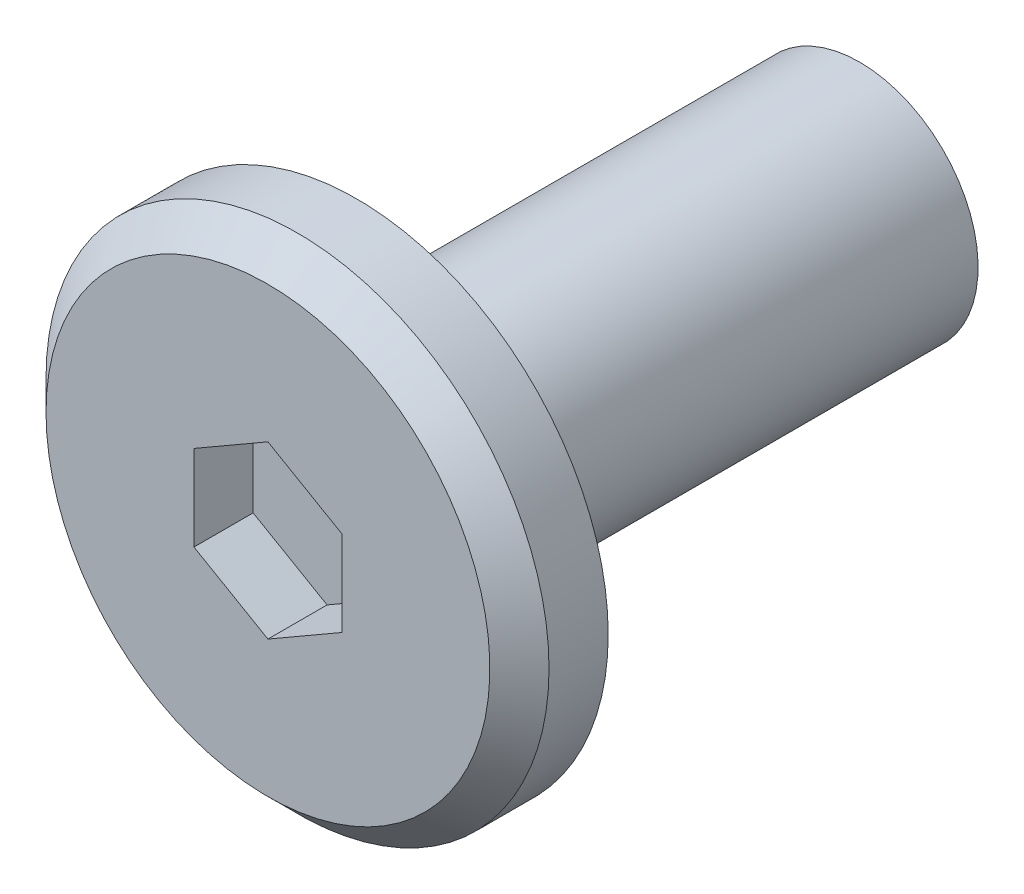
ISO-10303-21;
HEADER;
FILE_DESCRIPTION(('STEP AP214'),'2;1');
FILE_NAME('part.step','',(''),(''),'','','');
FILE_SCHEMA(('AUTOMOTIVE_DESIGN { 1 0 10303 214 1 1 1 1 }'));
ENDSEC;
DATA;
#1=APPLICATION_CONTEXT('core data for automotive mechanical design processes');
#2=APPLICATION_PROTOCOL_DEFINITION('international standard','automotive_design',2000,#1);
#3=PRODUCT_CONTEXT('',#1,'mechanical');
#4=PRODUCT('Part','Part','',(#3));
#5=PRODUCT_RELATED_PRODUCT_CATEGORY('part','',(#4));
#6=PRODUCT_DEFINITION_FORMATION('','',#4);
#7=PRODUCT_DEFINITION_CONTEXT('part definition',#1,'design');
#8=PRODUCT_DEFINITION('design','',#6,#7);
#9=PRODUCT_DEFINITION_SHAPE('','',#8);
#10=(LENGTH_UNIT() NAMED_UNIT(*) SI_UNIT(.MILLI.,.METRE.));
#11=(NAMED_UNIT(*) PLANE_ANGLE_UNIT() SI_UNIT($,.RADIAN.));
#12=(NAMED_UNIT(*) SI_UNIT($,.STERADIAN.) SOLID_ANGLE_UNIT());
#13=UNCERTAINTY_MEASURE_WITH_UNIT(LENGTH_MEASURE(1.E-05),#10,'distance_accuracy_value','');
#14=(GEOMETRIC_REPRESENTATION_CONTEXT(3) GLOBAL_UNCERTAINTY_ASSIGNED_CONTEXT((#13)) GLOBAL_UNIT_ASSIGNED_CONTEXT((#10,
#11,#12)) REPRESENTATION_CONTEXT('',''));
#15=CARTESIAN_POINT('',(0.,0.,0.));
#16=DIRECTION('',(0.,0.,1.));
#17=DIRECTION('',(1.,0.,0.));
#18=AXIS2_PLACEMENT_3D('',#15,#16,#17);
#19=CARTESIAN_POINT('',(172.530839914594,-193.837695743439,366.074757541018));
#20=DIRECTION('',(0.,0.,-1.));
#21=DIRECTION('',(1.,0.,0.));
#22=AXIS2_PLACEMENT_3D('',#19,#20,#21);
#23=CONICAL_SURFACE('',#22,3.75,0.785398162499995);
#24=CARTESIAN_POINT('',(172.530839914594,-193.837695743439,366.074757541018));
#25=DIRECTION('',(0.,0.,-1.));
#26=DIRECTION('',(-1.,0.,0.));
#27=AXIS2_PLACEMENT_3D('',#24,#25,#26);
#28=CIRCLE('',#27,3.75);
#29=CARTESIAN_POINT('',(168.780839914594,-193.837695743439,366.074757541018));
#30=VERTEX_POINT('',#29);
#31=EDGE_CURVE('E191',#30,#30,#28,.T.);
#32=ORIENTED_EDGE('',*,*,#31,.T.);
#33=EDGE_LOOP('',(#32));
#34=FACE_BOUND('',#33,.T.);
#35=CARTESIAN_POINT('',(172.530839914594,-193.837695743439,365.574757541018));
#36=DIRECTION('',(0.,0.,1.));
#37=DIRECTION('',(-1.,0.,0.));
#38=AXIS2_PLACEMENT_3D('',#35,#36,#37);
#39=CIRCLE('',#38,4.25);
#40=CARTESIAN_POINT('',(168.280839914593,-193.837695743439,365.574757541018));
#41=VERTEX_POINT('',#40);
#42=EDGE_CURVE('E216',#41,#41,#39,.T.);
#43=ORIENTED_EDGE('',*,*,#42,.T.);
#44=EDGE_LOOP('',(#43));
#45=FACE_BOUND('',#44,.T.);
#46=ADVANCED_FACE('F42',(#34,#45),#23,.T.);
#47=CARTESIAN_POINT('',(172.530839914594,-193.837695743439,364.574757541019));
#48=DIRECTION('',(0.,0.,1.));
#49=DIRECTION('',(1.,0.,0.));
#50=AXIS2_PLACEMENT_3D('',#47,#48,#49);
#51=PLANE('',#50);
#52=CARTESIAN_POINT('',(172.530839914594,-193.837695743439,364.574757541019));
#53=DIRECTION('',(0.,0.,-1.));
#54=DIRECTION('',(0.,1.,0.));
#55=AXIS2_PLACEMENT_3D('',#52,#53,#54);
#56=CIRCLE('',#55,1.5);
#57=CARTESIAN_POINT('',(172.530839914594,-192.337695743439,364.574757541019));
#58=VERTEX_POINT('',#57);
#59=EDGE_CURVE('E213',#58,#58,#56,.T.);
#60=ORIENTED_EDGE('',*,*,#59,.T.);
#61=EDGE_LOOP('',(#60));
#62=FACE_BOUND('',#61,.T.);
#63=ADVANCED_FACE('F249',(#62),#51,.F.);
#64=CARTESIAN_POINT('',(172.530839914594,-193.837695743439,365.074757541019));
#65=DIRECTION('',(0.,0.,1.));
#66=DIRECTION('',(1.,0.,0.));
#67=AXIS2_PLACEMENT_3D('',#64,#65,#66);
#68=PLANE('',#67);
#69=DIRECTION('',(-0.866025403784439,-0.5,0.));
#70=VECTOR('',#69,1.);
#71=CARTESIAN_POINT('',(172.530839914594,-195.281071416414,365.074757541019));
#72=LINE('',#71,#70);
#73=CARTESIAN_POINT('',(173.780839914594,-194.559383579927,365.074757541019));
#74=VERTEX_POINT('',#73);
#75=CARTESIAN_POINT('',(172.530839914594,-195.281071416414,365.074757541019));
#76=VERTEX_POINT('',#75);
#77=EDGE_CURVE('E53',#74,#76,#72,.T.);
#78=ORIENTED_EDGE('',*,*,#77,.F.);
#79=DIRECTION('',(0.,-1.,0.));
#80=VECTOR('',#79,1.);
#81=CARTESIAN_POINT('',(173.780839914594,-194.559383579927,365.074757541019));
#82=LINE('',#81,#80);
#83=CARTESIAN_POINT('',(173.780839914594,-193.116007906952,365.074757541019));
#84=VERTEX_POINT('',#83);
#85=EDGE_CURVE('E46',#84,#74,#82,.T.);
#86=ORIENTED_EDGE('',*,*,#85,.F.);
#87=DIRECTION('',(-0.866025403784439,0.5,0.));
#88=VECTOR('',#87,1.);
#89=CARTESIAN_POINT('',(173.780839914594,-193.116007906952,365.074757541019));
#90=LINE('',#89,#88);
#91=CARTESIAN_POINT('',(172.530839914594,-192.394320070465,365.074757541019));
#92=VERTEX_POINT('',#91);
#93=EDGE_CURVE('E166',#84,#92,#90,.T.);
#94=ORIENTED_EDGE('',*,*,#93,.T.);
#95=DIRECTION('',(0.866025403784439,0.5,0.));
#96=VECTOR('',#95,1.);
#97=CARTESIAN_POINT('',(172.530839914594,-192.394320070465,365.074757541019));
#98=LINE('',#97,#96);
#99=CARTESIAN_POINT('',(171.280839914594,-193.116007906952,365.074757541019));
#100=VERTEX_POINT('',#99);
#101=EDGE_CURVE('E134',#100,#92,#98,.T.);
#102=ORIENTED_EDGE('',*,*,#101,.F.);
#103=DIRECTION('',(0.,-1.,0.));
#104=VECTOR('',#103,1.);
#105=CARTESIAN_POINT('',(171.280839914594,-193.116007906952,365.074757541019));
#106=LINE('',#105,#104);
#107=CARTESIAN_POINT('',(171.280839914594,-194.559383579927,365.074757541019));
#108=VERTEX_POINT('',#107);
#109=EDGE_CURVE('E225',#100,#108,#106,.T.);
#110=ORIENTED_EDGE('',*,*,#109,.T.);
#111=DIRECTION('',(-0.866025403784438,0.5,0.));
#112=VECTOR('',#111,1.);
#113=CARTESIAN_POINT('',(171.280839914594,-194.559383579927,365.074757541019));
#114=LINE('',#113,#112);
#115=EDGE_CURVE('E11',#76,#108,#114,.T.);
#116=ORIENTED_EDGE('',*,*,#115,.F.);
#117=EDGE_LOOP('',(#78,#86,#94,#102,#110,#116));
#118=FACE_BOUND('',#117,.T.);
#119=ADVANCED_FACE('F254',(#118),#68,.T.);
#120=CARTESIAN_POINT('',(171.280839914594,-194.559383579927,350.874757541018));
#121=DIRECTION('',(0.5,0.866025403784438,0.));
#122=DIRECTION('',(0.,0.,-1.));
#123=AXIS2_PLACEMENT_3D('',#120,#121,#122);
#124=PLANE('',#123);
#125=DIRECTION('',(0.,0.,-1.));
#126=VECTOR('',#125,1.);
#127=CARTESIAN_POINT('',(171.280839914594,-194.559383579927,350.874757541018));
#128=LINE('',#127,#126);
#129=CARTESIAN_POINT('',(171.280839914594,-194.559383579927,366.074757541018));
#130=VERTEX_POINT('',#129);
#131=EDGE_CURVE('E221',#130,#108,#128,.T.);
#132=ORIENTED_EDGE('',*,*,#131,.F.);
#133=DIRECTION('',(0.866025403784438,-0.5,0.));
#134=VECTOR('',#133,1.);
#135=CARTESIAN_POINT('',(171.905839914593,-194.92022749817,366.074757541018));
#136=LINE('',#135,#134);
#137=CARTESIAN_POINT('',(172.530839914594,-195.281071416414,366.074757541018));
#138=VERTEX_POINT('',#137);
#139=EDGE_CURVE('E206',#130,#138,#136,.T.);
#140=ORIENTED_EDGE('',*,*,#139,.T.);
#141=DIRECTION('',(0.,0.,-1.));
#142=VECTOR('',#141,1.);
#143=CARTESIAN_POINT('',(172.530839914594,-195.281071416414,350.874757541018));
#144=LINE('',#143,#142);
#145=EDGE_CURVE('E197',#138,#76,#144,.T.);
#146=ORIENTED_EDGE('',*,*,#145,.T.);
#147=ORIENTED_EDGE('',*,*,#115,.T.);
#148=EDGE_LOOP('',(#132,#140,#146,#147));
#149=FACE_BOUND('',#148,.T.);
#150=ADVANCED_FACE('F285',(#149),#124,.T.);
#151=CARTESIAN_POINT('',(172.530839914594,-195.281071416414,350.874757541018));
#152=DIRECTION('',(-0.5,0.866025403784439,0.));
#153=DIRECTION('',(0.,0.,1.));
#154=AXIS2_PLACEMENT_3D('',#151,#152,#153);
#155=PLANE('',#154);
#156=ORIENTED_EDGE('',*,*,#145,.F.);
#157=DIRECTION('',(0.866025403784439,0.5,0.));
#158=VECTOR('',#157,1.);
#159=CARTESIAN_POINT('',(173.155839914593,-194.92022749817,366.074757541018));
#160=LINE('',#159,#158);
#161=CARTESIAN_POINT('',(173.780839914594,-194.559383579927,366.074757541018));
#162=VERTEX_POINT('',#161);
#163=EDGE_CURVE('E180',#138,#162,#160,.T.);
#164=ORIENTED_EDGE('',*,*,#163,.T.);
#165=DIRECTION('',(0.,0.,-1.));
#166=VECTOR('',#165,1.);
#167=CARTESIAN_POINT('',(173.780839914594,-194.559383579927,350.874757541018));
#168=LINE('',#167,#166);
#169=EDGE_CURVE('E175',#162,#74,#168,.T.);
#170=ORIENTED_EDGE('',*,*,#169,.T.);
#171=ORIENTED_EDGE('',*,*,#77,.T.);
#172=EDGE_LOOP('',(#156,#164,#170,#171));
#173=FACE_BOUND('',#172,.T.);
#174=ADVANCED_FACE('F289',(#173),#155,.T.);
#175=CARTESIAN_POINT('',(173.780839914594,-194.559383579927,350.874757541018));
#176=DIRECTION('',(-1.,0.,0.));
#177=DIRECTION('',(0.,0.,1.));
#178=AXIS2_PLACEMENT_3D('',#175,#176,#177);
#179=PLANE('',#178);
#180=ORIENTED_EDGE('',*,*,#169,.F.);
#181=DIRECTION('',(0.,1.,0.));
#182=VECTOR('',#181,1.);
#183=CARTESIAN_POINT('',(173.780839914594,-193.837695743439,366.074757541018));
#184=LINE('',#183,#182);
#185=CARTESIAN_POINT('',(173.780839914594,-193.116007906952,366.074757541018));
#186=VERTEX_POINT('',#185);
#187=EDGE_CURVE('E172',#162,#186,#184,.T.);
#188=ORIENTED_EDGE('',*,*,#187,.T.);
#189=DIRECTION('',(0.,0.,-1.));
#190=VECTOR('',#189,1.);
#191=CARTESIAN_POINT('',(173.780839914594,-193.116007906952,350.874757541018));
#192=LINE('',#191,#190);
#193=EDGE_CURVE('E159',#186,#84,#192,.T.);
#194=ORIENTED_EDGE('',*,*,#193,.T.);
#195=ORIENTED_EDGE('',*,*,#85,.T.);
#196=EDGE_LOOP('',(#180,#188,#194,#195));
#197=FACE_BOUND('',#196,.T.);
#198=ADVANCED_FACE('F173',(#197),#179,.T.);
#199=CARTESIAN_POINT('',(173.780839914594,-193.116007906952,350.874757541018));
#200=DIRECTION('',(-0.5,-0.866025403784439,0.));
#201=DIRECTION('',(-0.866025403784439,0.5,0.));
#202=AXIS2_PLACEMENT_3D('',#199,#200,#201);
#203=PLANE('',#202);
#204=ORIENTED_EDGE('',*,*,#193,.F.);
#205=DIRECTION('',(-0.866025403784439,0.5,0.));
#206=VECTOR('',#205,1.);
#207=CARTESIAN_POINT('',(173.155839914593,-192.755163988709,366.074757541018));
#208=LINE('',#207,#206);
#209=CARTESIAN_POINT('',(172.530839914594,-192.394320070465,366.074757541018));
#210=VERTEX_POINT('',#209);
#211=EDGE_CURVE('E164',#186,#210,#208,.T.);
#212=ORIENTED_EDGE('',*,*,#211,.T.);
#213=DIRECTION('',(0.,0.,-1.));
#214=VECTOR('',#213,1.);
#215=CARTESIAN_POINT('',(172.530839914594,-192.394320070465,350.874757541018));
#216=LINE('',#215,#214);
#217=EDGE_CURVE('E195',#210,#92,#216,.T.);
#218=ORIENTED_EDGE('',*,*,#217,.T.);
#219=ORIENTED_EDGE('',*,*,#93,.F.);
#220=EDGE_LOOP('',(#204,#212,#218,#219));
#221=FACE_BOUND('',#220,.T.);
#222=ADVANCED_FACE('F161',(#221),#203,.T.);
#223=CARTESIAN_POINT('',(172.530839914594,-192.394320070465,350.874757541018));
#224=DIRECTION('',(0.5,-0.866025403784439,0.));
#225=DIRECTION('',(0.,0.,-1.));
#226=AXIS2_PLACEMENT_3D('',#223,#224,#225);
#227=PLANE('',#226);
#228=ORIENTED_EDGE('',*,*,#217,.F.);
#229=DIRECTION('',(-0.866025403784439,-0.5,0.));
#230=VECTOR('',#229,1.);
#231=CARTESIAN_POINT('',(171.905839914593,-192.755163988709,366.074757541018));
#232=LINE('',#231,#230);
#233=CARTESIAN_POINT('',(171.280839914594,-193.116007906952,366.074757541018));
#234=VERTEX_POINT('',#233);
#235=EDGE_CURVE('E184',#210,#234,#232,.T.);
#236=ORIENTED_EDGE('',*,*,#235,.T.);
#237=DIRECTION('',(0.,0.,-1.));
#238=VECTOR('',#237,1.);
#239=CARTESIAN_POINT('',(171.280839914594,-193.116007906952,350.874757541018));
#240=LINE('',#239,#238);
#241=EDGE_CURVE('E150',#234,#100,#240,.T.);
#242=ORIENTED_EDGE('',*,*,#241,.T.);
#243=ORIENTED_EDGE('',*,*,#101,.T.);
#244=EDGE_LOOP('',(#228,#236,#242,#243));
#245=FACE_BOUND('',#244,.T.);
#246=ADVANCED_FACE('F266',(#245),#227,.T.);
#247=CARTESIAN_POINT('',(171.280839914594,-193.116007906952,350.874757541018));
#248=DIRECTION('',(1.,0.,0.));
#249=DIRECTION('',(0.,1.,0.));
#250=AXIS2_PLACEMENT_3D('',#247,#248,#249);
#251=PLANE('',#250);
#252=ORIENTED_EDGE('',*,*,#241,.F.);
#253=DIRECTION('',(0.,-1.,0.));
#254=VECTOR('',#253,1.);
#255=CARTESIAN_POINT('',(171.280839914594,-193.837695743439,366.074757541018));
#256=LINE('',#255,#254);
#257=EDGE_CURVE('E207',#234,#130,#256,.T.);
#258=ORIENTED_EDGE('',*,*,#257,.T.);
#259=ORIENTED_EDGE('',*,*,#131,.T.);
#260=ORIENTED_EDGE('',*,*,#109,.F.);
#261=EDGE_LOOP('',(#252,#258,#259,#260));
#262=FACE_BOUND('',#261,.T.);
#263=ADVANCED_FACE('F259',(#262),#251,.T.);
#264=CARTESIAN_POINT('',(172.530839914594,-193.837695743439,364.574757541019));
#265=DIRECTION('',(0.,0.,1.));
#266=DIRECTION('',(1.,0.,0.));
#267=AXIS2_PLACEMENT_3D('',#264,#265,#266);
#268=PLANE('',#267);
#269=CARTESIAN_POINT('',(172.530839914594,-193.837695743439,364.574757541019));
#270=DIRECTION('',(0.,0.,-1.));
#271=DIRECTION('',(-1.,0.,0.));
#272=AXIS2_PLACEMENT_3D('',#269,#270,#271);
#273=CIRCLE('',#272,4.25);
#274=CARTESIAN_POINT('',(168.280839914593,-193.837695743439,364.574757541019));
#275=VERTEX_POINT('',#274);
#276=EDGE_CURVE('E124',#275,#275,#273,.T.);
#277=ORIENTED_EDGE('',*,*,#276,.T.);
#278=EDGE_LOOP('',(#277));
#279=FACE_BOUND('',#278,.T.);
#280=CARTESIAN_POINT('',(172.530839914594,-193.837695743439,364.574757541019));
#281=DIRECTION('',(0.,0.,1.));
#282=DIRECTION('',(-1.,0.,0.));
#283=AXIS2_PLACEMENT_3D('',#280,#281,#282);
#284=CIRCLE('',#283,2.);
#285=CARTESIAN_POINT('',(170.530839914594,-193.837695743439,364.574757541019));
#286=VERTEX_POINT('',#285);
#287=EDGE_CURVE('E102',#286,#286,#284,.T.);
#288=ORIENTED_EDGE('',*,*,#287,.T.);
#289=EDGE_LOOP('',(#288));
#290=FACE_BOUND('',#289,.T.);
#291=ADVANCED_FACE('F261',(#279,#290),#268,.F.);
#292=CARTESIAN_POINT('',(172.530839914594,-193.837695743439,364.574757541019));
#293=DIRECTION('',(0.,0.,1.));
#294=DIRECTION('',(-1.,0.,0.));
#295=AXIS2_PLACEMENT_3D('',#292,#293,#294);
#296=CYLINDRICAL_SURFACE('',#295,4.25);
#297=ORIENTED_EDGE('',*,*,#276,.F.);
#298=EDGE_LOOP('',(#297));
#299=FACE_BOUND('',#298,.T.);
#300=ORIENTED_EDGE('',*,*,#42,.F.);
#301=EDGE_LOOP('',(#300));
#302=FACE_BOUND('',#301,.T.);
#303=ADVANCED_FACE('F264',(#299,#302),#296,.T.);
#304=CARTESIAN_POINT('',(172.530839914594,-193.837695743439,364.074757541019));
#305=DIRECTION('',(0.,0.,-1.));
#306=DIRECTION('',(1.,0.,0.));
#307=AXIS2_PLACEMENT_3D('',#304,#305,#306);
#308=CYLINDRICAL_SURFACE('',#307,1.5);
#309=ORIENTED_EDGE('',*,*,#59,.F.);
#310=EDGE_LOOP('',(#309));
#311=FACE_BOUND('',#310,.T.);
#312=CARTESIAN_POINT('',(172.530839914594,-193.837695743439,356.074757541019));
#313=DIRECTION('',(0.,0.,1.));
#314=DIRECTION('',(-1.,0.,0.));
#315=AXIS2_PLACEMENT_3D('',#312,#313,#314);
#316=CIRCLE('',#315,1.5);
#317=CARTESIAN_POINT('',(171.030839914594,-193.837695743439,356.074757541019));
#318=VERTEX_POINT('',#317);
#319=EDGE_CURVE('E111',#318,#318,#316,.T.);
#320=ORIENTED_EDGE('',*,*,#319,.F.);
#321=EDGE_LOOP('',(#320));
#322=FACE_BOUND('',#321,.T.);
#323=ADVANCED_FACE('F267',(#311,#322),#308,.F.);
#324=CARTESIAN_POINT('',(172.530839914594,-193.837695743439,356.074757541019));
#325=DIRECTION('',(0.,0.,1.));
#326=DIRECTION('',(1.,0.,0.));
#327=AXIS2_PLACEMENT_3D('',#324,#325,#326);
#328=PLANE('',#327);
#329=CARTESIAN_POINT('',(172.530839914594,-193.837695743439,356.074757541019));
#330=DIRECTION('',(0.,0.,-1.));
#331=DIRECTION('',(0.,1.,0.));
#332=AXIS2_PLACEMENT_3D('',#329,#330,#331);
#333=CIRCLE('',#332,2.);
#334=CARTESIAN_POINT('',(172.530839914594,-191.837695743439,356.074757541019));
#335=VERTEX_POINT('',#334);
#336=EDGE_CURVE('E210',#335,#335,#333,.T.);
#337=ORIENTED_EDGE('',*,*,#336,.T.);
#338=EDGE_LOOP('',(#337));
#339=FACE_BOUND('',#338,.T.);
#340=ORIENTED_EDGE('',*,*,#319,.T.);
#341=EDGE_LOOP('',(#340));
#342=FACE_BOUND('',#341,.T.);
#343=ADVANCED_FACE('F245',(#339,#342),#328,.F.);
#344=CARTESIAN_POINT('',(172.530839914594,-193.837695743439,356.074757541019));
#345=DIRECTION('',(0.,0.,1.));
#346=DIRECTION('',(-1.,0.,0.));
#347=AXIS2_PLACEMENT_3D('',#344,#345,#346);
#348=CYLINDRICAL_SURFACE('',#347,2.);
#349=ORIENTED_EDGE('',*,*,#287,.F.);
#350=EDGE_LOOP('',(#349));
#351=FACE_BOUND('',#350,.T.);
#352=ORIENTED_EDGE('',*,*,#336,.F.);
#353=EDGE_LOOP('',(#352));
#354=FACE_BOUND('',#353,.T.);
#355=ADVANCED_FACE('F241',(#351,#354),#348,.T.);
#356=CARTESIAN_POINT('',(172.530839914594,-193.837695743439,366.074757541018));
#357=DIRECTION('',(0.,0.,1.));
#358=DIRECTION('',(1.,0.,0.));
#359=AXIS2_PLACEMENT_3D('',#356,#357,#358);
#360=PLANE('',#359);
#361=ORIENTED_EDGE('',*,*,#235,.F.);
#362=ORIENTED_EDGE('',*,*,#211,.F.);
#363=ORIENTED_EDGE('',*,*,#187,.F.);
#364=ORIENTED_EDGE('',*,*,#163,.F.);
#365=ORIENTED_EDGE('',*,*,#139,.F.);
#366=ORIENTED_EDGE('',*,*,#257,.F.);
#367=EDGE_LOOP('',(#361,#362,#363,#364,#365,#366));
#368=FACE_BOUND('',#367,.T.);
#369=ORIENTED_EDGE('',*,*,#31,.F.);
#370=EDGE_LOOP('',(#369));
#371=FACE_BOUND('',#370,.T.);
#372=ADVANCED_FACE('F44',(#368,#371),#360,.T.);
#373=CLOSED_SHELL('',(#46,#63,#119,#150,#174,#198,#222,#246,#263,#291,#303,#323,#343,#355,#372));
#374=MANIFOLD_SOLID_BREP('B2',#373);
#375=ADVANCED_BREP_SHAPE_REPRESENTATION('',(#18,#374),#14);
#376=SHAPE_DEFINITION_REPRESENTATION(#9,#375);
ENDSEC;
END-ISO-10303-21;
